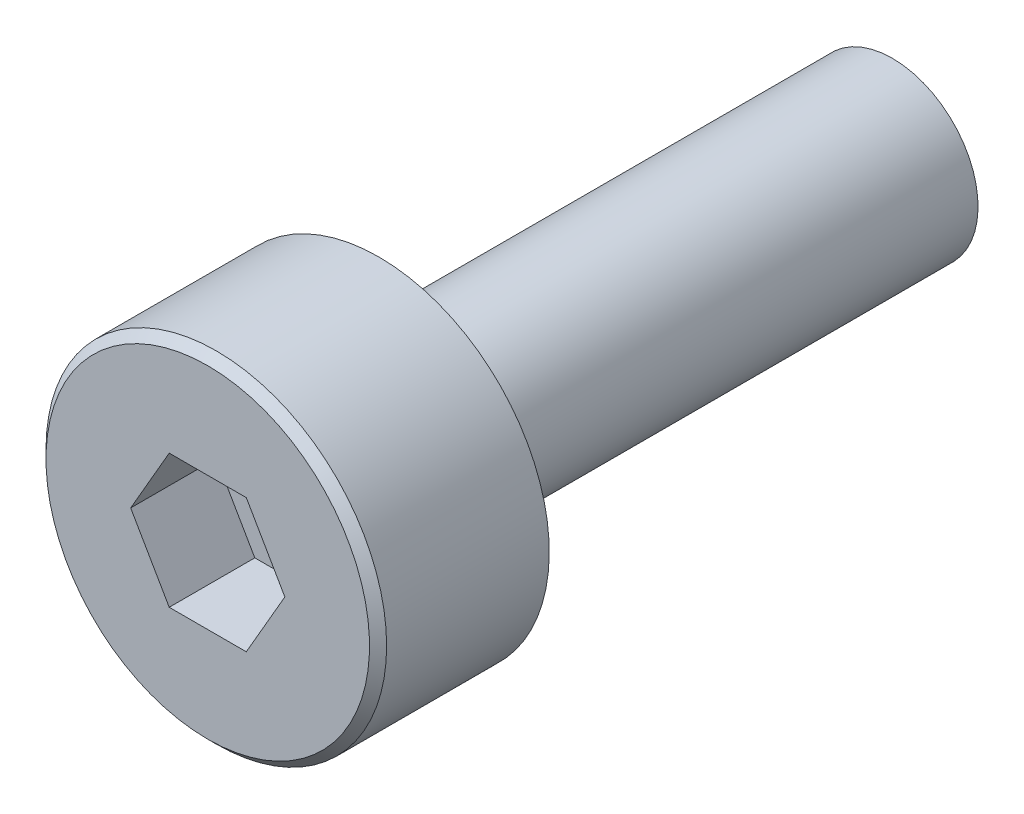
ISO-10303-21;
HEADER;
FILE_DESCRIPTION(('STEP AP214'),'2;1');
FILE_NAME('part.step','',(''),(''),'','','');
FILE_SCHEMA(('AUTOMOTIVE_DESIGN { 1 0 10303 214 1 1 1 1 }'));
ENDSEC;
DATA;
#1=APPLICATION_CONTEXT('core data for automotive mechanical design processes');
#2=APPLICATION_PROTOCOL_DEFINITION('international standard','automotive_design',2000,#1);
#3=PRODUCT_CONTEXT('',#1,'mechanical');
#4=PRODUCT('Part','Part','',(#3));
#5=PRODUCT_RELATED_PRODUCT_CATEGORY('part','',(#4));
#6=PRODUCT_DEFINITION_FORMATION('','',#4);
#7=PRODUCT_DEFINITION_CONTEXT('part definition',#1,'design');
#8=PRODUCT_DEFINITION('design','',#6,#7);
#9=PRODUCT_DEFINITION_SHAPE('','',#8);
#10=(LENGTH_UNIT() NAMED_UNIT(*) SI_UNIT(.MILLI.,.METRE.));
#11=(NAMED_UNIT(*) PLANE_ANGLE_UNIT() SI_UNIT($,.RADIAN.));
#12=(NAMED_UNIT(*) SI_UNIT($,.STERADIAN.) SOLID_ANGLE_UNIT());
#13=UNCERTAINTY_MEASURE_WITH_UNIT(LENGTH_MEASURE(1.E-05),#10,'distance_accuracy_value','');
#14=(GEOMETRIC_REPRESENTATION_CONTEXT(3) GLOBAL_UNCERTAINTY_ASSIGNED_CONTEXT((#13)) GLOBAL_UNIT_ASSIGNED_CONTEXT((#10,
#11,#12)) REPRESENTATION_CONTEXT('',''));
#15=CARTESIAN_POINT('',(0.,0.,0.));
#16=DIRECTION('',(0.,0.,1.));
#17=DIRECTION('',(1.,0.,0.));
#18=AXIS2_PLACEMENT_3D('',#15,#16,#17);
#19=CARTESIAN_POINT('',(0.,0.,0.));
#20=DIRECTION('',(0.,0.,1.));
#21=DIRECTION('',(0.,-1.,0.));
#22=AXIS2_PLACEMENT_3D('',#19,#20,#21);
#23=PLANE('',#22);
#24=CARTESIAN_POINT('',(0.,0.,0.));
#25=DIRECTION('',(0.,0.,1.));
#26=DIRECTION('',(0.,-1.,0.));
#27=AXIS2_PLACEMENT_3D('',#24,#25,#26);
#28=CIRCLE('',#27,1.89);
#29=CARTESIAN_POINT('',(0.,-1.89,0.));
#30=VERTEX_POINT('',#29);
#31=EDGE_CURVE('E11',#30,#30,#28,.T.);
#32=ORIENTED_EDGE('',*,*,#31,.T.);
#33=EDGE_LOOP('',(#32));
#34=FACE_BOUND('',#33,.T.);
#35=DIRECTION('',(-0.5,0.866025403784438,0.));
#36=VECTOR('',#35,1.);
#37=CARTESIAN_POINT('',(0.900666419935816,0.,0.));
#38=LINE('',#37,#36);
#39=CARTESIAN_POINT('',(0.900666419935816,0.,0.));
#40=VERTEX_POINT('',#39);
#41=CARTESIAN_POINT('',(0.450333209967908,0.78,0.));
#42=VERTEX_POINT('',#41);
#43=EDGE_CURVE('E56',#40,#42,#38,.T.);
#44=ORIENTED_EDGE('',*,*,#43,.F.);
#45=DIRECTION('',(0.5,0.866025403784439,0.));
#46=VECTOR('',#45,1.);
#47=CARTESIAN_POINT('',(0.450333209967907,-0.78,0.));
#48=LINE('',#47,#46);
#49=CARTESIAN_POINT('',(0.450333209967907,-0.78,0.));
#50=VERTEX_POINT('',#49);
#51=EDGE_CURVE('E139',#50,#40,#48,.T.);
#52=ORIENTED_EDGE('',*,*,#51,.F.);
#53=DIRECTION('',(1.,0.,0.));
#54=VECTOR('',#53,1.);
#55=CARTESIAN_POINT('',(-0.450333209967908,-0.78,0.));
#56=LINE('',#55,#54);
#57=CARTESIAN_POINT('',(-0.450333209967908,-0.78,0.));
#58=VERTEX_POINT('',#57);
#59=EDGE_CURVE('E137',#58,#50,#56,.T.);
#60=ORIENTED_EDGE('',*,*,#59,.F.);
#61=DIRECTION('',(0.5,-0.866025403784438,0.));
#62=VECTOR('',#61,1.);
#63=CARTESIAN_POINT('',(-0.900666419935817,0.,0.));
#64=LINE('',#63,#62);
#65=CARTESIAN_POINT('',(-0.900666419935817,0.,0.));
#66=VERTEX_POINT('',#65);
#67=EDGE_CURVE('E104',#66,#58,#64,.T.);
#68=ORIENTED_EDGE('',*,*,#67,.F.);
#69=DIRECTION('',(-0.5,-0.866025403784439,0.));
#70=VECTOR('',#69,1.);
#71=CARTESIAN_POINT('',(-0.450333209967909,0.78,0.));
#72=LINE('',#71,#70);
#73=CARTESIAN_POINT('',(-0.450333209967909,0.78,0.));
#74=VERTEX_POINT('',#73);
#75=EDGE_CURVE('E133',#74,#66,#72,.T.);
#76=ORIENTED_EDGE('',*,*,#75,.F.);
#77=DIRECTION('',(-1.,0.,0.));
#78=VECTOR('',#77,1.);
#79=CARTESIAN_POINT('',(0.450333209967908,0.78,0.));
#80=LINE('',#79,#78);
#81=EDGE_CURVE('E130',#42,#74,#80,.T.);
#82=ORIENTED_EDGE('',*,*,#81,.F.);
#83=EDGE_LOOP('',(#44,#52,#60,#68,#76,#82));
#84=FACE_BOUND('',#83,.T.);
#85=ADVANCED_FACE('F40',(#34,#84),#23,.T.);
#86=CARTESIAN_POINT('',(0.,0.,-8.));
#87=DIRECTION('',(0.,0.,-1.));
#88=DIRECTION('',(0.,1.,0.));
#89=AXIS2_PLACEMENT_3D('',#86,#87,#88);
#90=CYLINDRICAL_SURFACE('',#89,1.99);
#91=CARTESIAN_POINT('',(0.,0.,-0.0999999999999977));
#92=DIRECTION('',(0.,0.,1.));
#93=DIRECTION('',(0.,-1.,0.));
#94=AXIS2_PLACEMENT_3D('',#91,#92,#93);
#95=CIRCLE('',#94,1.99);
#96=CARTESIAN_POINT('',(0.,-1.99,-0.0999999999999977));
#97=VERTEX_POINT('',#96);
#98=EDGE_CURVE('E49',#97,#97,#95,.F.);
#99=ORIENTED_EDGE('',*,*,#98,.T.);
#100=EDGE_LOOP('',(#99));
#101=FACE_BOUND('',#100,.T.);
#102=CARTESIAN_POINT('',(0.,0.,-2.));
#103=DIRECTION('',(0.,0.,-1.));
#104=DIRECTION('',(0.,1.,0.));
#105=AXIS2_PLACEMENT_3D('',#102,#103,#104);
#106=CIRCLE('',#105,1.99);
#107=CARTESIAN_POINT('',(0.,1.99,-2.));
#108=VERTEX_POINT('',#107);
#109=EDGE_CURVE('E154',#108,#108,#106,.T.);
#110=ORIENTED_EDGE('',*,*,#109,.F.);
#111=EDGE_LOOP('',(#110));
#112=FACE_BOUND('',#111,.T.);
#113=ADVANCED_FACE('F159',(#101,#112),#90,.T.);
#114=CARTESIAN_POINT('',(0.,1.99,-2.));
#115=DIRECTION('',(0.,0.,-1.));
#116=DIRECTION('',(0.,1.,0.));
#117=AXIS2_PLACEMENT_3D('',#114,#115,#116);
#118=PLANE('',#117);
#119=ORIENTED_EDGE('',*,*,#109,.T.);
#120=EDGE_LOOP('',(#119));
#121=FACE_BOUND('',#120,.T.);
#122=CARTESIAN_POINT('',(0.,0.,-2.));
#123=DIRECTION('',(0.,0.,-1.));
#124=DIRECTION('',(0.,1.,0.));
#125=AXIS2_PLACEMENT_3D('',#122,#123,#124);
#126=CIRCLE('',#125,0.999999999999998);
#127=CARTESIAN_POINT('',(0.,0.999999999999998,-2.));
#128=VERTEX_POINT('',#127);
#129=EDGE_CURVE('E151',#128,#128,#126,.T.);
#130=ORIENTED_EDGE('',*,*,#129,.F.);
#131=EDGE_LOOP('',(#130));
#132=FACE_BOUND('',#131,.T.);
#133=ADVANCED_FACE('F175',(#121,#132),#118,.T.);
#134=CARTESIAN_POINT('',(0.,0.,-8.));
#135=DIRECTION('',(0.,0.,-1.));
#136=DIRECTION('',(0.,1.,0.));
#137=AXIS2_PLACEMENT_3D('',#134,#135,#136);
#138=CYLINDRICAL_SURFACE('',#137,0.999999999999998);
#139=ORIENTED_EDGE('',*,*,#129,.T.);
#140=EDGE_LOOP('',(#139));
#141=FACE_BOUND('',#140,.T.);
#142=CARTESIAN_POINT('',(0.,0.,-8.));
#143=DIRECTION('',(0.,0.,-1.));
#144=DIRECTION('',(0.,1.,0.));
#145=AXIS2_PLACEMENT_3D('',#142,#143,#144);
#146=CIRCLE('',#145,0.999999999999998);
#147=CARTESIAN_POINT('',(0.,0.999999999999998,-8.));
#148=VERTEX_POINT('',#147);
#149=EDGE_CURVE('E143',#148,#148,#146,.T.);
#150=ORIENTED_EDGE('',*,*,#149,.F.);
#151=EDGE_LOOP('',(#150));
#152=FACE_BOUND('',#151,.T.);
#153=ADVANCED_FACE('F181',(#141,#152),#138,.T.);
#154=CARTESIAN_POINT('',(0.,0.999999999999998,-8.));
#155=DIRECTION('',(0.,0.,-1.));
#156=DIRECTION('',(0.,1.,0.));
#157=AXIS2_PLACEMENT_3D('',#154,#155,#156);
#158=PLANE('',#157);
#159=ORIENTED_EDGE('',*,*,#149,.T.);
#160=EDGE_LOOP('',(#159));
#161=FACE_BOUND('',#160,.T.);
#162=ADVANCED_FACE('F185',(#161),#158,.T.);
#163=CARTESIAN_POINT('',(0.900666419935816,0.,-1.));
#164=DIRECTION('',(0.866025403784438,0.5,0.));
#165=DIRECTION('',(-0.5,0.866025403784439,0.));
#166=AXIS2_PLACEMENT_3D('',#163,#164,#165);
#167=PLANE('',#166);
#168=ORIENTED_EDGE('',*,*,#43,.T.);
#169=DIRECTION('',(0.,0.,1.));
#170=VECTOR('',#169,1.);
#171=CARTESIAN_POINT('',(0.450333209967908,0.78,-1.));
#172=LINE('',#171,#170);
#173=CARTESIAN_POINT('',(0.450333209967908,0.78,-1.));
#174=VERTEX_POINT('',#173);
#175=EDGE_CURVE('E86',#174,#42,#172,.T.);
#176=ORIENTED_EDGE('',*,*,#175,.F.);
#177=DIRECTION('',(-0.5,0.866025403784438,0.));
#178=VECTOR('',#177,1.);
#179=CARTESIAN_POINT('',(0.900666419935816,0.,-1.));
#180=LINE('',#179,#178);
#181=CARTESIAN_POINT('',(0.900666419935816,0.,-1.));
#182=VERTEX_POINT('',#181);
#183=EDGE_CURVE('E141',#182,#174,#180,.T.);
#184=ORIENTED_EDGE('',*,*,#183,.F.);
#185=DIRECTION('',(0.,0.,1.));
#186=VECTOR('',#185,1.);
#187=CARTESIAN_POINT('',(0.900666419935816,0.,-1.));
#188=LINE('',#187,#186);
#189=EDGE_CURVE('E64',#182,#40,#188,.T.);
#190=ORIENTED_EDGE('',*,*,#189,.T.);
#191=EDGE_LOOP('',(#168,#176,#184,#190));
#192=FACE_BOUND('',#191,.T.);
#193=ADVANCED_FACE('F189',(#192),#167,.F.);
#194=CARTESIAN_POINT('',(0.450333209967907,-0.78,-1.));
#195=DIRECTION('',(0.866025403784439,-0.5,0.));
#196=DIRECTION('',(0.5,0.866025403784439,0.));
#197=AXIS2_PLACEMENT_3D('',#194,#195,#196);
#198=PLANE('',#197);
#199=ORIENTED_EDGE('',*,*,#51,.T.);
#200=ORIENTED_EDGE('',*,*,#189,.F.);
#201=DIRECTION('',(0.5,0.866025403784439,0.));
#202=VECTOR('',#201,1.);
#203=CARTESIAN_POINT('',(0.450333209967907,-0.78,-1.));
#204=LINE('',#203,#202);
#205=CARTESIAN_POINT('',(0.450333209967907,-0.78,-1.));
#206=VERTEX_POINT('',#205);
#207=EDGE_CURVE('E116',#206,#182,#204,.T.);
#208=ORIENTED_EDGE('',*,*,#207,.F.);
#209=DIRECTION('',(0.,0.,1.));
#210=VECTOR('',#209,1.);
#211=CARTESIAN_POINT('',(0.450333209967907,-0.78,-1.));
#212=LINE('',#211,#210);
#213=EDGE_CURVE('E108',#206,#50,#212,.T.);
#214=ORIENTED_EDGE('',*,*,#213,.T.);
#215=EDGE_LOOP('',(#199,#200,#208,#214));
#216=FACE_BOUND('',#215,.T.);
#217=ADVANCED_FACE('F193',(#216),#198,.F.);
#218=CARTESIAN_POINT('',(-0.450333209967908,-0.78,-1.));
#219=DIRECTION('',(0.,-1.,0.));
#220=DIRECTION('',(0.,0.,-1.));
#221=AXIS2_PLACEMENT_3D('',#218,#219,#220);
#222=PLANE('',#221);
#223=ORIENTED_EDGE('',*,*,#59,.T.);
#224=ORIENTED_EDGE('',*,*,#213,.F.);
#225=DIRECTION('',(1.,0.,0.));
#226=VECTOR('',#225,1.);
#227=CARTESIAN_POINT('',(-0.450333209967908,-0.78,-1.));
#228=LINE('',#227,#226);
#229=CARTESIAN_POINT('',(-0.450333209967908,-0.78,-1.));
#230=VERTEX_POINT('',#229);
#231=EDGE_CURVE('E112',#230,#206,#228,.T.);
#232=ORIENTED_EDGE('',*,*,#231,.F.);
#233=DIRECTION('',(0.,0.,1.));
#234=VECTOR('',#233,1.);
#235=CARTESIAN_POINT('',(-0.450333209967908,-0.78,-1.));
#236=LINE('',#235,#234);
#237=EDGE_CURVE('E97',#230,#58,#236,.T.);
#238=ORIENTED_EDGE('',*,*,#237,.T.);
#239=EDGE_LOOP('',(#223,#224,#232,#238));
#240=FACE_BOUND('',#239,.T.);
#241=ADVANCED_FACE('F113',(#240),#222,.F.);
#242=CARTESIAN_POINT('',(-0.900666419935817,0.,-1.));
#243=DIRECTION('',(-0.866025403784439,-0.5,0.));
#244=DIRECTION('',(0.5,-0.866025403784438,0.));
#245=AXIS2_PLACEMENT_3D('',#242,#243,#244);
#246=PLANE('',#245);
#247=ORIENTED_EDGE('',*,*,#67,.T.);
#248=ORIENTED_EDGE('',*,*,#237,.F.);
#249=DIRECTION('',(0.5,-0.866025403784438,0.));
#250=VECTOR('',#249,1.);
#251=CARTESIAN_POINT('',(-0.900666419935817,0.,-1.));
#252=LINE('',#251,#250);
#253=CARTESIAN_POINT('',(-0.900666419935817,0.,-1.));
#254=VERTEX_POINT('',#253);
#255=EDGE_CURVE('E101',#254,#230,#252,.T.);
#256=ORIENTED_EDGE('',*,*,#255,.F.);
#257=DIRECTION('',(0.,0.,1.));
#258=VECTOR('',#257,1.);
#259=CARTESIAN_POINT('',(-0.900666419935817,0.,-1.));
#260=LINE('',#259,#258);
#261=EDGE_CURVE('E109',#254,#66,#260,.T.);
#262=ORIENTED_EDGE('',*,*,#261,.T.);
#263=EDGE_LOOP('',(#247,#248,#256,#262));
#264=FACE_BOUND('',#263,.T.);
#265=ADVANCED_FACE('F99',(#264),#246,.F.);
#266=CARTESIAN_POINT('',(-0.450333209967909,0.78,-1.));
#267=DIRECTION('',(-0.866025403784439,0.5,0.));
#268=DIRECTION('',(-0.5,-0.866025403784439,0.));
#269=AXIS2_PLACEMENT_3D('',#266,#267,#268);
#270=PLANE('',#269);
#271=ORIENTED_EDGE('',*,*,#75,.T.);
#272=ORIENTED_EDGE('',*,*,#261,.F.);
#273=DIRECTION('',(-0.5,-0.866025403784439,0.));
#274=VECTOR('',#273,1.);
#275=CARTESIAN_POINT('',(-0.450333209967909,0.78,-1.));
#276=LINE('',#275,#274);
#277=CARTESIAN_POINT('',(-0.450333209967909,0.78,-1.));
#278=VERTEX_POINT('',#277);
#279=EDGE_CURVE('E122',#278,#254,#276,.T.);
#280=ORIENTED_EDGE('',*,*,#279,.F.);
#281=DIRECTION('',(0.,0.,1.));
#282=VECTOR('',#281,1.);
#283=CARTESIAN_POINT('',(-0.450333209967909,0.78,-1.));
#284=LINE('',#283,#282);
#285=EDGE_CURVE('E146',#278,#74,#284,.T.);
#286=ORIENTED_EDGE('',*,*,#285,.T.);
#287=EDGE_LOOP('',(#271,#272,#280,#286));
#288=FACE_BOUND('',#287,.T.);
#289=ADVANCED_FACE('F196',(#288),#270,.F.);
#290=CARTESIAN_POINT('',(0.450333209967908,0.78,-1.));
#291=DIRECTION('',(0.,1.,0.));
#292=DIRECTION('',(-1.,0.,0.));
#293=AXIS2_PLACEMENT_3D('',#290,#291,#292);
#294=PLANE('',#293);
#295=ORIENTED_EDGE('',*,*,#81,.T.);
#296=ORIENTED_EDGE('',*,*,#285,.F.);
#297=DIRECTION('',(-1.,0.,0.));
#298=VECTOR('',#297,1.);
#299=CARTESIAN_POINT('',(0.450333209967908,0.78,-1.));
#300=LINE('',#299,#298);
#301=EDGE_CURVE('E124',#174,#278,#300,.T.);
#302=ORIENTED_EDGE('',*,*,#301,.F.);
#303=ORIENTED_EDGE('',*,*,#175,.T.);
#304=EDGE_LOOP('',(#295,#296,#302,#303));
#305=FACE_BOUND('',#304,.T.);
#306=ADVANCED_FACE('F167',(#305),#294,.F.);
#307=CARTESIAN_POINT('',(0.,0.,-1.));
#308=DIRECTION('',(0.,0.,1.));
#309=DIRECTION('',(1.,0.,0.));
#310=AXIS2_PLACEMENT_3D('',#307,#308,#309);
#311=PLANE('',#310);
#312=ORIENTED_EDGE('',*,*,#183,.T.);
#313=ORIENTED_EDGE('',*,*,#301,.T.);
#314=ORIENTED_EDGE('',*,*,#279,.T.);
#315=ORIENTED_EDGE('',*,*,#255,.T.);
#316=ORIENTED_EDGE('',*,*,#231,.T.);
#317=ORIENTED_EDGE('',*,*,#207,.T.);
#318=EDGE_LOOP('',(#312,#313,#314,#315,#316,#317));
#319=FACE_BOUND('',#318,.T.);
#320=ADVANCED_FACE('F119',(#319),#311,.T.);
#321=CARTESIAN_POINT('',(0.,0.,-0.0999999999999977));
#322=DIRECTION('',(0.,0.,-1.));
#323=DIRECTION('',(0.,1.,0.));
#324=AXIS2_PLACEMENT_3D('',#321,#322,#323);
#325=CONICAL_SURFACE('',#324,1.99,0.785398163397455);
#326=ORIENTED_EDGE('',*,*,#31,.F.);
#327=EDGE_LOOP('',(#326));
#328=FACE_BOUND('',#327,.T.);
#329=ORIENTED_EDGE('',*,*,#98,.F.);
#330=EDGE_LOOP('',(#329));
#331=FACE_BOUND('',#330,.T.);
#332=ADVANCED_FACE('F43',(#328,#331),#325,.T.);
#333=CLOSED_SHELL('',(#85,#113,#133,#153,#162,#193,#217,#241,#265,#289,#306,#320,#332));
#334=MANIFOLD_SOLID_BREP('B2',#333);
#335=ADVANCED_BREP_SHAPE_REPRESENTATION('',(#18,#334),#14);
#336=SHAPE_DEFINITION_REPRESENTATION(#9,#335);
ENDSEC;
END-ISO-10303-21;
